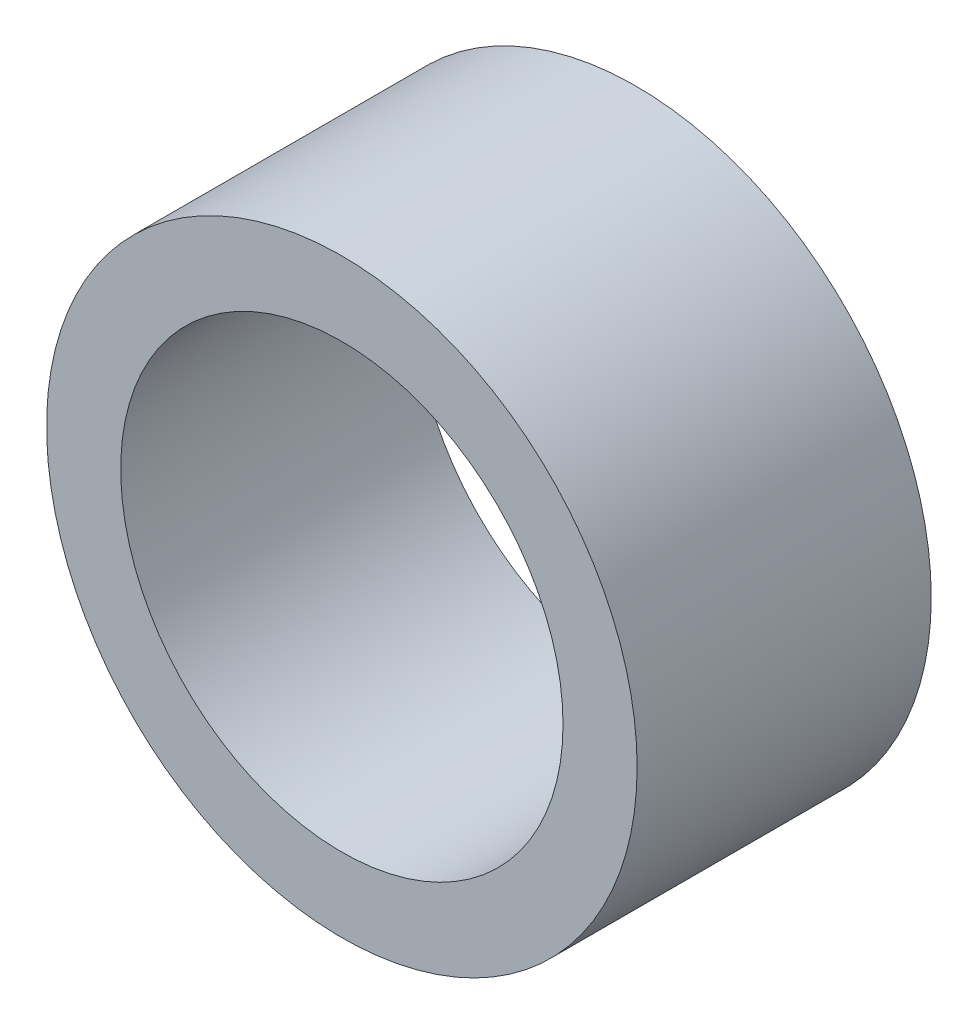
ISO-10303-21;
HEADER;
FILE_DESCRIPTION(('STEP AP214'),'2;1');
FILE_NAME('part.step','',(''),(''),'','','');
FILE_SCHEMA(('AUTOMOTIVE_DESIGN { 1 0 10303 214 1 1 1 1 }'));
ENDSEC;
DATA;
#1=APPLICATION_CONTEXT('core data for automotive mechanical design processes');
#2=APPLICATION_PROTOCOL_DEFINITION('international standard','automotive_design',2000,#1);
#3=PRODUCT_CONTEXT('',#1,'mechanical');
#4=PRODUCT('Part','Part','',(#3));
#5=PRODUCT_RELATED_PRODUCT_CATEGORY('part','',(#4));
#6=PRODUCT_DEFINITION_FORMATION('','',#4);
#7=PRODUCT_DEFINITION_CONTEXT('part definition',#1,'design');
#8=PRODUCT_DEFINITION('design','',#6,#7);
#9=PRODUCT_DEFINITION_SHAPE('','',#8);
#10=(LENGTH_UNIT() NAMED_UNIT(*) SI_UNIT(.MILLI.,.METRE.));
#11=(NAMED_UNIT(*) PLANE_ANGLE_UNIT() SI_UNIT($,.RADIAN.));
#12=(NAMED_UNIT(*) SI_UNIT($,.STERADIAN.) SOLID_ANGLE_UNIT());
#13=UNCERTAINTY_MEASURE_WITH_UNIT(LENGTH_MEASURE(1.E-05),#10,'distance_accuracy_value','');
#14=(GEOMETRIC_REPRESENTATION_CONTEXT(3) GLOBAL_UNCERTAINTY_ASSIGNED_CONTEXT((#13)) GLOBAL_UNIT_ASSIGNED_CONTEXT((#10,
#11,#12)) REPRESENTATION_CONTEXT('',''));
#15=CARTESIAN_POINT('',(0.,0.,0.));
#16=DIRECTION('',(0.,0.,1.));
#17=DIRECTION('',(1.,0.,0.));
#18=AXIS2_PLACEMENT_3D('',#15,#16,#17);
#19=CARTESIAN_POINT('',(0.,0.,3.175));
#20=DIRECTION('',(0.,0.,1.));
#21=DIRECTION('',(1.,0.,0.));
#22=AXIS2_PLACEMENT_3D('',#19,#20,#21);
#23=PLANE('',#22);
#24=CARTESIAN_POINT('',(0.,0.,3.175));
#25=DIRECTION('',(0.,0.,1.));
#26=DIRECTION('',(1.,0.,0.));
#27=AXIS2_PLACEMENT_3D('',#24,#25,#26);
#28=CIRCLE('',#27,6.3754);
#29=CARTESIAN_POINT('',(6.3754,0.,3.175));
#30=VERTEX_POINT('',#29);
#31=EDGE_CURVE('E10',#30,#30,#28,.T.);
#32=ORIENTED_EDGE('',*,*,#31,.T.);
#33=EDGE_LOOP('',(#32));
#34=FACE_BOUND('',#33,.T.);
#35=CARTESIAN_POINT('',(0.,0.,3.175));
#36=DIRECTION('',(0.,0.,1.));
#37=DIRECTION('',(1.,0.,0.));
#38=AXIS2_PLACEMENT_3D('',#35,#36,#37);
#39=CIRCLE('',#38,4.7752);
#40=CARTESIAN_POINT('',(4.7752,0.,3.175));
#41=VERTEX_POINT('',#40);
#42=EDGE_CURVE('E50',#41,#41,#39,.T.);
#43=ORIENTED_EDGE('',*,*,#42,.F.);
#44=EDGE_LOOP('',(#43));
#45=FACE_BOUND('',#44,.T.);
#46=ADVANCED_FACE('F39',(#34,#45),#23,.T.);
#47=CARTESIAN_POINT('',(0.,0.,-3.175));
#48=DIRECTION('',(0.,0.,1.));
#49=DIRECTION('',(1.,0.,0.));
#50=AXIS2_PLACEMENT_3D('',#47,#48,#49);
#51=PLANE('',#50);
#52=CARTESIAN_POINT('',(0.,0.,-3.175));
#53=DIRECTION('',(0.,0.,1.));
#54=DIRECTION('',(1.,0.,0.));
#55=AXIS2_PLACEMENT_3D('',#52,#53,#54);
#56=CIRCLE('',#55,6.3754);
#57=CARTESIAN_POINT('',(6.3754,0.,-3.175));
#58=VERTEX_POINT('',#57);
#59=EDGE_CURVE('E43',#58,#58,#56,.T.);
#60=ORIENTED_EDGE('',*,*,#59,.F.);
#61=EDGE_LOOP('',(#60));
#62=FACE_BOUND('',#61,.T.);
#63=CARTESIAN_POINT('',(0.,0.,-3.175));
#64=DIRECTION('',(0.,0.,1.));
#65=DIRECTION('',(1.,0.,0.));
#66=AXIS2_PLACEMENT_3D('',#63,#64,#65);
#67=CIRCLE('',#66,4.7752);
#68=CARTESIAN_POINT('',(4.7752,0.,-3.175));
#69=VERTEX_POINT('',#68);
#70=EDGE_CURVE('E52',#69,#69,#67,.T.);
#71=ORIENTED_EDGE('',*,*,#70,.T.);
#72=EDGE_LOOP('',(#71));
#73=FACE_BOUND('',#72,.T.);
#74=ADVANCED_FACE('F62',(#62,#73),#51,.F.);
#75=CARTESIAN_POINT('',(0.,0.,3.175));
#76=DIRECTION('',(0.,0.,-1.));
#77=DIRECTION('',(-1.,0.,0.));
#78=AXIS2_PLACEMENT_3D('',#75,#76,#77);
#79=CYLINDRICAL_SURFACE('',#78,6.3754);
#80=ORIENTED_EDGE('',*,*,#31,.F.);
#81=EDGE_LOOP('',(#80));
#82=FACE_BOUND('',#81,.T.);
#83=ORIENTED_EDGE('',*,*,#59,.T.);
#84=EDGE_LOOP('',(#83));
#85=FACE_BOUND('',#84,.T.);
#86=ADVANCED_FACE('F41',(#82,#85),#79,.T.);
#87=CARTESIAN_POINT('',(0.,0.,3.175));
#88=DIRECTION('',(0.,0.,-1.));
#89=DIRECTION('',(-1.,0.,0.));
#90=AXIS2_PLACEMENT_3D('',#87,#88,#89);
#91=CYLINDRICAL_SURFACE('',#90,4.7752);
#92=ORIENTED_EDGE('',*,*,#42,.T.);
#93=EDGE_LOOP('',(#92));
#94=FACE_BOUND('',#93,.T.);
#95=ORIENTED_EDGE('',*,*,#70,.F.);
#96=EDGE_LOOP('',(#95));
#97=FACE_BOUND('',#96,.T.);
#98=ADVANCED_FACE('F58',(#94,#97),#91,.F.);
#99=CLOSED_SHELL('',(#46,#74,#86,#98));
#100=MANIFOLD_SOLID_BREP('B2',#99);
#101=ADVANCED_BREP_SHAPE_REPRESENTATION('',(#18,#100),#14);
#102=SHAPE_DEFINITION_REPRESENTATION(#9,#101);
ENDSEC;
END-ISO-10303-21;
